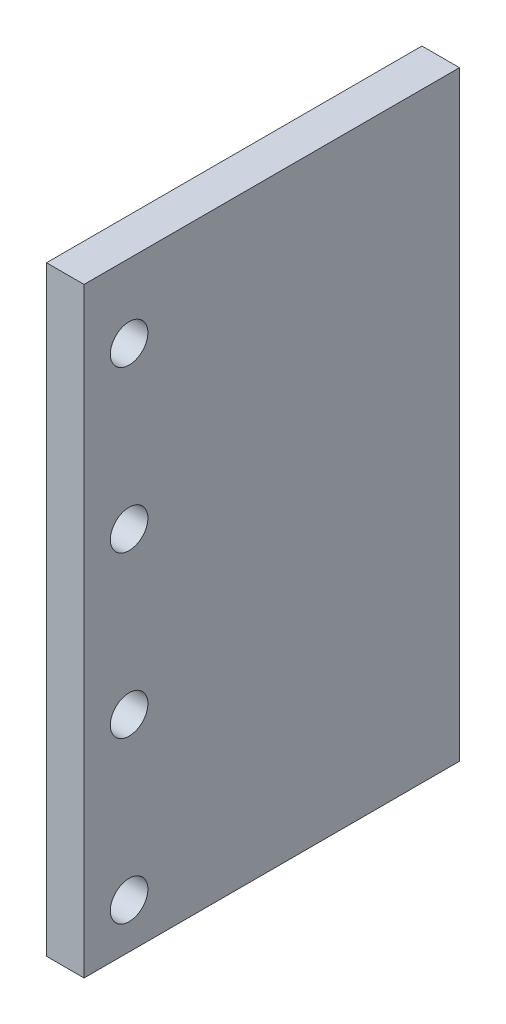
ISO-10303-21;
HEADER;
FILE_DESCRIPTION(('STEP AP214'),'2;1');
FILE_NAME('part.step','',(''),(''),'','','');
FILE_SCHEMA(('AUTOMOTIVE_DESIGN { 1 0 10303 214 1 1 1 1 }'));
ENDSEC;
DATA;
#1=APPLICATION_CONTEXT('core data for automotive mechanical design processes');
#2=APPLICATION_PROTOCOL_DEFINITION('international standard','automotive_design',2000,#1);
#3=PRODUCT_CONTEXT('',#1,'mechanical');
#4=PRODUCT('Part','Part','',(#3));
#5=PRODUCT_RELATED_PRODUCT_CATEGORY('part','',(#4));
#6=PRODUCT_DEFINITION_FORMATION('','',#4);
#7=PRODUCT_DEFINITION_CONTEXT('part definition',#1,'design');
#8=PRODUCT_DEFINITION('design','',#6,#7);
#9=PRODUCT_DEFINITION_SHAPE('','',#8);
#10=(LENGTH_UNIT() NAMED_UNIT(*) SI_UNIT(.MILLI.,.METRE.));
#11=(NAMED_UNIT(*) PLANE_ANGLE_UNIT() SI_UNIT($,.RADIAN.));
#12=(NAMED_UNIT(*) SI_UNIT($,.STERADIAN.) SOLID_ANGLE_UNIT());
#13=UNCERTAINTY_MEASURE_WITH_UNIT(LENGTH_MEASURE(1.E-05),#10,'distance_accuracy_value','');
#14=(GEOMETRIC_REPRESENTATION_CONTEXT(3) GLOBAL_UNCERTAINTY_ASSIGNED_CONTEXT((#13)) GLOBAL_UNIT_ASSIGNED_CONTEXT((#10,
#11,#12)) REPRESENTATION_CONTEXT('',''));
#15=CARTESIAN_POINT('',(0.,0.,0.));
#16=DIRECTION('',(0.,0.,1.));
#17=DIRECTION('',(1.,0.,0.));
#18=AXIS2_PLACEMENT_3D('',#15,#16,#17);
#19=CARTESIAN_POINT('',(2.5,0.,0.));
#20=DIRECTION('',(-1.,0.,0.));
#21=DIRECTION('',(0.,0.,1.));
#22=AXIS2_PLACEMENT_3D('',#19,#20,#21);
#23=PLANE('',#22);
#24=DIRECTION('',(0.,0.,-1.));
#25=VECTOR('',#24,1.);
#26=CARTESIAN_POINT('',(2.5,0.,0.));
#27=LINE('',#26,#25);
#28=CARTESIAN_POINT('',(2.5,0.,25.));
#29=VERTEX_POINT('',#28);
#30=CARTESIAN_POINT('',(2.5,0.,0.));
#31=VERTEX_POINT('',#30);
#32=EDGE_CURVE('E91',#29,#31,#27,.T.);
#33=ORIENTED_EDGE('',*,*,#32,.T.);
#34=DIRECTION('',(0.,1.,0.));
#35=VECTOR('',#34,1.);
#36=CARTESIAN_POINT('',(2.5,0.,0.));
#37=LINE('',#36,#35);
#38=CARTESIAN_POINT('',(2.5,40.,0.));
#39=VERTEX_POINT('',#38);
#40=EDGE_CURVE('E86',#31,#39,#37,.T.);
#41=ORIENTED_EDGE('',*,*,#40,.T.);
#42=DIRECTION('',(0.,0.,1.));
#43=VECTOR('',#42,1.);
#44=CARTESIAN_POINT('',(2.5,40.,0.));
#45=LINE('',#44,#43);
#46=CARTESIAN_POINT('',(2.5,40.,25.));
#47=VERTEX_POINT('',#46);
#48=EDGE_CURVE('E87',#39,#47,#45,.T.);
#49=ORIENTED_EDGE('',*,*,#48,.T.);
#50=DIRECTION('',(0.,-1.,0.));
#51=VECTOR('',#50,1.);
#52=CARTESIAN_POINT('',(2.5,0.,25.));
#53=LINE('',#52,#51);
#54=EDGE_CURVE('E57',#47,#29,#53,.T.);
#55=ORIENTED_EDGE('',*,*,#54,.T.);
#56=EDGE_LOOP('',(#33,#41,#49,#55));
#57=FACE_BOUND('',#56,.T.);
#58=CARTESIAN_POINT('',(2.5,3.,22.));
#59=DIRECTION('',(1.,0.,0.));
#60=DIRECTION('',(0.,0.,-1.));
#61=AXIS2_PLACEMENT_3D('',#58,#59,#60);
#62=CIRCLE('',#61,1.25);
#63=CARTESIAN_POINT('',(2.5,3.,20.75));
#64=VERTEX_POINT('',#63);
#65=EDGE_CURVE('E107',#64,#64,#62,.T.);
#66=ORIENTED_EDGE('',*,*,#65,.F.);
#67=EDGE_LOOP('',(#66));
#68=FACE_BOUND('',#67,.T.);
#69=CARTESIAN_POINT('',(2.5,13.7,22.));
#70=DIRECTION('',(1.,0.,0.));
#71=DIRECTION('',(0.,0.,-1.));
#72=AXIS2_PLACEMENT_3D('',#69,#70,#71);
#73=CIRCLE('',#72,1.25);
#74=CARTESIAN_POINT('',(2.5,13.7,20.75));
#75=VERTEX_POINT('',#74);
#76=EDGE_CURVE('E123',#75,#75,#73,.T.);
#77=ORIENTED_EDGE('',*,*,#76,.F.);
#78=EDGE_LOOP('',(#77));
#79=FACE_BOUND('',#78,.T.);
#80=CARTESIAN_POINT('',(2.5,24.4,22.));
#81=DIRECTION('',(1.,0.,0.));
#82=DIRECTION('',(0.,0.,-1.));
#83=AXIS2_PLACEMENT_3D('',#80,#81,#82);
#84=CIRCLE('',#83,1.25);
#85=CARTESIAN_POINT('',(2.5,24.4,20.75));
#86=VERTEX_POINT('',#85);
#87=EDGE_CURVE('E130',#86,#86,#84,.T.);
#88=ORIENTED_EDGE('',*,*,#87,.F.);
#89=EDGE_LOOP('',(#88));
#90=FACE_BOUND('',#89,.T.);
#91=CARTESIAN_POINT('',(2.5,35.1,22.));
#92=DIRECTION('',(1.,0.,0.));
#93=DIRECTION('',(0.,0.,-1.));
#94=AXIS2_PLACEMENT_3D('',#91,#92,#93);
#95=CIRCLE('',#94,1.25);
#96=CARTESIAN_POINT('',(2.5,35.1,20.75));
#97=VERTEX_POINT('',#96);
#98=EDGE_CURVE('E133',#97,#97,#95,.T.);
#99=ORIENTED_EDGE('',*,*,#98,.F.);
#100=EDGE_LOOP('',(#99));
#101=FACE_BOUND('',#100,.T.);
#102=ADVANCED_FACE('F39',(#57,#68,#79,#90,#101),#23,.F.);
#103=CARTESIAN_POINT('',(0.,0.,0.));
#104=DIRECTION('',(-1.,0.,0.));
#105=DIRECTION('',(0.,0.,1.));
#106=AXIS2_PLACEMENT_3D('',#103,#104,#105);
#107=PLANE('',#106);
#108=CARTESIAN_POINT('',(0.,24.4,22.));
#109=DIRECTION('',(1.,0.,0.));
#110=DIRECTION('',(0.,0.,-1.));
#111=AXIS2_PLACEMENT_3D('',#108,#109,#110);
#112=CIRCLE('',#111,1.25);
#113=CARTESIAN_POINT('',(0.,24.4,20.75));
#114=VERTEX_POINT('',#113);
#115=EDGE_CURVE('E127',#114,#114,#112,.T.);
#116=ORIENTED_EDGE('',*,*,#115,.T.);
#117=EDGE_LOOP('',(#116));
#118=FACE_BOUND('',#117,.T.);
#119=CARTESIAN_POINT('',(0.,3.,22.));
#120=DIRECTION('',(1.,0.,0.));
#121=DIRECTION('',(0.,0.,-1.));
#122=AXIS2_PLACEMENT_3D('',#119,#120,#121);
#123=CIRCLE('',#122,1.25);
#124=CARTESIAN_POINT('',(0.,3.,20.75));
#125=VERTEX_POINT('',#124);
#126=EDGE_CURVE('E120',#125,#125,#123,.T.);
#127=ORIENTED_EDGE('',*,*,#126,.T.);
#128=EDGE_LOOP('',(#127));
#129=FACE_BOUND('',#128,.T.);
#130=DIRECTION('',(0.,0.,-1.));
#131=VECTOR('',#130,1.);
#132=CARTESIAN_POINT('',(0.,0.,0.));
#133=LINE('',#132,#131);
#134=CARTESIAN_POINT('',(0.,0.,25.));
#135=VERTEX_POINT('',#134);
#136=CARTESIAN_POINT('',(0.,0.,0.));
#137=VERTEX_POINT('',#136);
#138=EDGE_CURVE('E104',#135,#137,#133,.T.);
#139=ORIENTED_EDGE('',*,*,#138,.F.);
#140=DIRECTION('',(0.,-1.,0.));
#141=VECTOR('',#140,1.);
#142=CARTESIAN_POINT('',(0.,0.,25.));
#143=LINE('',#142,#141);
#144=CARTESIAN_POINT('',(0.,40.,25.));
#145=VERTEX_POINT('',#144);
#146=EDGE_CURVE('E80',#145,#135,#143,.T.);
#147=ORIENTED_EDGE('',*,*,#146,.F.);
#148=DIRECTION('',(0.,0.,1.));
#149=VECTOR('',#148,1.);
#150=CARTESIAN_POINT('',(0.,40.,0.));
#151=LINE('',#150,#149);
#152=CARTESIAN_POINT('',(0.,40.,0.));
#153=VERTEX_POINT('',#152);
#154=EDGE_CURVE('E75',#153,#145,#151,.T.);
#155=ORIENTED_EDGE('',*,*,#154,.F.);
#156=DIRECTION('',(0.,1.,0.));
#157=VECTOR('',#156,1.);
#158=CARTESIAN_POINT('',(0.,0.,0.));
#159=LINE('',#158,#157);
#160=EDGE_CURVE('E94',#137,#153,#159,.T.);
#161=ORIENTED_EDGE('',*,*,#160,.F.);
#162=EDGE_LOOP('',(#139,#147,#155,#161));
#163=FACE_BOUND('',#162,.T.);
#164=CARTESIAN_POINT('',(0.,13.7,22.));
#165=DIRECTION('',(1.,0.,0.));
#166=DIRECTION('',(0.,0.,-1.));
#167=AXIS2_PLACEMENT_3D('',#164,#165,#166);
#168=CIRCLE('',#167,1.25);
#169=CARTESIAN_POINT('',(0.,13.7,20.75));
#170=VERTEX_POINT('',#169);
#171=EDGE_CURVE('E125',#170,#170,#168,.T.);
#172=ORIENTED_EDGE('',*,*,#171,.T.);
#173=EDGE_LOOP('',(#172));
#174=FACE_BOUND('',#173,.T.);
#175=CARTESIAN_POINT('',(0.,35.1,22.));
#176=DIRECTION('',(1.,0.,0.));
#177=DIRECTION('',(0.,0.,-1.));
#178=AXIS2_PLACEMENT_3D('',#175,#176,#177);
#179=CIRCLE('',#178,1.25);
#180=CARTESIAN_POINT('',(0.,35.1,20.75));
#181=VERTEX_POINT('',#180);
#182=EDGE_CURVE('E136',#181,#181,#179,.T.);
#183=ORIENTED_EDGE('',*,*,#182,.T.);
#184=EDGE_LOOP('',(#183));
#185=FACE_BOUND('',#184,.T.);
#186=ADVANCED_FACE('F114',(#118,#129,#163,#174,#185),#107,.T.);
#187=CARTESIAN_POINT('',(2.5,0.,0.));
#188=DIRECTION('',(0.,1.,0.));
#189=DIRECTION('',(0.,0.,1.));
#190=AXIS2_PLACEMENT_3D('',#187,#188,#189);
#191=PLANE('',#190);
#192=ORIENTED_EDGE('',*,*,#138,.T.);
#193=DIRECTION('',(-1.,0.,0.));
#194=VECTOR('',#193,1.);
#195=CARTESIAN_POINT('',(2.5,0.,0.));
#196=LINE('',#195,#194);
#197=EDGE_CURVE('E11',#31,#137,#196,.T.);
#198=ORIENTED_EDGE('',*,*,#197,.F.);
#199=ORIENTED_EDGE('',*,*,#32,.F.);
#200=DIRECTION('',(-1.,0.,0.));
#201=VECTOR('',#200,1.);
#202=CARTESIAN_POINT('',(2.5,0.,25.));
#203=LINE('',#202,#201);
#204=EDGE_CURVE('E98',#29,#135,#203,.T.);
#205=ORIENTED_EDGE('',*,*,#204,.T.);
#206=EDGE_LOOP('',(#192,#198,#199,#205));
#207=FACE_BOUND('',#206,.T.);
#208=ADVANCED_FACE('F41',(#207),#191,.F.);
#209=CARTESIAN_POINT('',(2.5,0.,0.));
#210=DIRECTION('',(0.,0.,1.));
#211=DIRECTION('',(1.,0.,0.));
#212=AXIS2_PLACEMENT_3D('',#209,#210,#211);
#213=PLANE('',#212);
#214=ORIENTED_EDGE('',*,*,#160,.T.);
#215=DIRECTION('',(-1.,0.,0.));
#216=VECTOR('',#215,1.);
#217=CARTESIAN_POINT('',(2.5,40.,0.));
#218=LINE('',#217,#216);
#219=EDGE_CURVE('E48',#39,#153,#218,.T.);
#220=ORIENTED_EDGE('',*,*,#219,.F.);
#221=ORIENTED_EDGE('',*,*,#40,.F.);
#222=ORIENTED_EDGE('',*,*,#197,.T.);
#223=EDGE_LOOP('',(#214,#220,#221,#222));
#224=FACE_BOUND('',#223,.T.);
#225=ADVANCED_FACE('F92',(#224),#213,.F.);
#226=CARTESIAN_POINT('',(2.5,40.,0.));
#227=DIRECTION('',(0.,-1.,0.));
#228=DIRECTION('',(0.,0.,-1.));
#229=AXIS2_PLACEMENT_3D('',#226,#227,#228);
#230=PLANE('',#229);
#231=ORIENTED_EDGE('',*,*,#154,.T.);
#232=DIRECTION('',(-1.,0.,0.));
#233=VECTOR('',#232,1.);
#234=CARTESIAN_POINT('',(2.5,40.,25.));
#235=LINE('',#234,#233);
#236=EDGE_CURVE('E96',#47,#145,#235,.T.);
#237=ORIENTED_EDGE('',*,*,#236,.F.);
#238=ORIENTED_EDGE('',*,*,#48,.F.);
#239=ORIENTED_EDGE('',*,*,#219,.T.);
#240=EDGE_LOOP('',(#231,#237,#238,#239));
#241=FACE_BOUND('',#240,.T.);
#242=ADVANCED_FACE('F100',(#241),#230,.F.);
#243=CARTESIAN_POINT('',(2.5,0.,25.));
#244=DIRECTION('',(0.,0.,-1.));
#245=DIRECTION('',(-1.,0.,0.));
#246=AXIS2_PLACEMENT_3D('',#243,#244,#245);
#247=PLANE('',#246);
#248=ORIENTED_EDGE('',*,*,#146,.T.);
#249=ORIENTED_EDGE('',*,*,#204,.F.);
#250=ORIENTED_EDGE('',*,*,#54,.F.);
#251=ORIENTED_EDGE('',*,*,#236,.T.);
#252=EDGE_LOOP('',(#248,#249,#250,#251));
#253=FACE_BOUND('',#252,.T.);
#254=ADVANCED_FACE('F112',(#253),#247,.F.);
#255=CARTESIAN_POINT('',(2.5,3.,22.));
#256=DIRECTION('',(-1.,0.,0.));
#257=DIRECTION('',(0.,0.,1.));
#258=AXIS2_PLACEMENT_3D('',#255,#256,#257);
#259=CYLINDRICAL_SURFACE('',#258,1.25);
#260=ORIENTED_EDGE('',*,*,#65,.T.);
#261=EDGE_LOOP('',(#260));
#262=FACE_BOUND('',#261,.T.);
#263=ORIENTED_EDGE('',*,*,#126,.F.);
#264=EDGE_LOOP('',(#263));
#265=FACE_BOUND('',#264,.T.);
#266=ADVANCED_FACE('F155',(#262,#265),#259,.F.);
#267=CARTESIAN_POINT('',(2.5,13.7,22.));
#268=DIRECTION('',(-1.,0.,0.));
#269=DIRECTION('',(0.,0.,1.));
#270=AXIS2_PLACEMENT_3D('',#267,#268,#269);
#271=CYLINDRICAL_SURFACE('',#270,1.25);
#272=ORIENTED_EDGE('',*,*,#76,.T.);
#273=EDGE_LOOP('',(#272));
#274=FACE_BOUND('',#273,.T.);
#275=ORIENTED_EDGE('',*,*,#171,.F.);
#276=EDGE_LOOP('',(#275));
#277=FACE_BOUND('',#276,.T.);
#278=ADVANCED_FACE('F200',(#274,#277),#271,.F.);
#279=CARTESIAN_POINT('',(2.5,24.4,22.));
#280=DIRECTION('',(-1.,0.,0.));
#281=DIRECTION('',(0.,0.,1.));
#282=AXIS2_PLACEMENT_3D('',#279,#280,#281);
#283=CYLINDRICAL_SURFACE('',#282,1.25);
#284=ORIENTED_EDGE('',*,*,#87,.T.);
#285=EDGE_LOOP('',(#284));
#286=FACE_BOUND('',#285,.T.);
#287=ORIENTED_EDGE('',*,*,#115,.F.);
#288=EDGE_LOOP('',(#287));
#289=FACE_BOUND('',#288,.T.);
#290=ADVANCED_FACE('F207',(#286,#289),#283,.F.);
#291=CARTESIAN_POINT('',(2.5,35.1,22.));
#292=DIRECTION('',(-1.,0.,0.));
#293=DIRECTION('',(0.,0.,1.));
#294=AXIS2_PLACEMENT_3D('',#291,#292,#293);
#295=CYLINDRICAL_SURFACE('',#294,1.25);
#296=ORIENTED_EDGE('',*,*,#98,.T.);
#297=EDGE_LOOP('',(#296));
#298=FACE_BOUND('',#297,.T.);
#299=ORIENTED_EDGE('',*,*,#182,.F.);
#300=EDGE_LOOP('',(#299));
#301=FACE_BOUND('',#300,.T.);
#302=ADVANCED_FACE('F145',(#298,#301),#295,.F.);
#303=CLOSED_SHELL('',(#102,#186,#208,#225,#242,#254,#266,#278,#290,#302));
#304=MANIFOLD_SOLID_BREP('B2',#303);
#305=ADVANCED_BREP_SHAPE_REPRESENTATION('',(#18,#304),#14);
#306=SHAPE_DEFINITION_REPRESENTATION(#9,#305);
ENDSEC;
END-ISO-10303-21;
